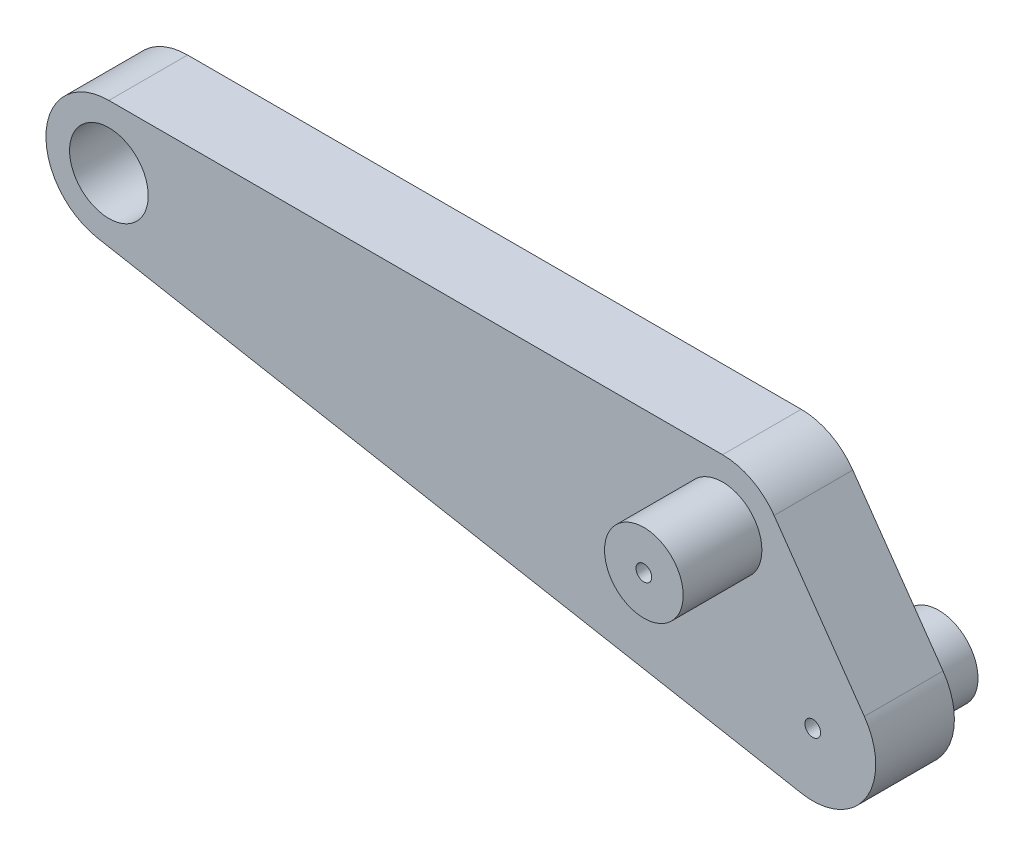
ISO-10303-21;
HEADER;
FILE_DESCRIPTION(('STEP AP214'),'2;1');
FILE_NAME('part.step','',(''),(''),'','','');
FILE_SCHEMA(('AUTOMOTIVE_DESIGN { 1 0 10303 214 1 1 1 1 }'));
ENDSEC;
DATA;
#1=APPLICATION_CONTEXT('core data for automotive mechanical design processes');
#2=APPLICATION_PROTOCOL_DEFINITION('international standard','automotive_design',2000,#1);
#3=PRODUCT_CONTEXT('',#1,'mechanical');
#4=PRODUCT('Part','Part','',(#3));
#5=PRODUCT_RELATED_PRODUCT_CATEGORY('part','',(#4));
#6=PRODUCT_DEFINITION_FORMATION('','',#4);
#7=PRODUCT_DEFINITION_CONTEXT('part definition',#1,'design');
#8=PRODUCT_DEFINITION('design','',#6,#7);
#9=PRODUCT_DEFINITION_SHAPE('','',#8);
#10=(LENGTH_UNIT() NAMED_UNIT(*) SI_UNIT(.MILLI.,.METRE.));
#11=(NAMED_UNIT(*) PLANE_ANGLE_UNIT() SI_UNIT($,.RADIAN.));
#12=(NAMED_UNIT(*) SI_UNIT($,.STERADIAN.) SOLID_ANGLE_UNIT());
#13=UNCERTAINTY_MEASURE_WITH_UNIT(LENGTH_MEASURE(1.E-05),#10,'distance_accuracy_value','');
#14=(GEOMETRIC_REPRESENTATION_CONTEXT(3) GLOBAL_UNCERTAINTY_ASSIGNED_CONTEXT((#13)) GLOBAL_UNIT_ASSIGNED_CONTEXT((#10,
#11,#12)) REPRESENTATION_CONTEXT('',''));
#15=CARTESIAN_POINT('',(0.,0.,0.));
#16=DIRECTION('',(0.,0.,1.));
#17=DIRECTION('',(1.,0.,0.));
#18=AXIS2_PLACEMENT_3D('',#15,#16,#17);
#19=CARTESIAN_POINT('',(0.,0.,5.));
#20=DIRECTION('',(0.,0.,1.));
#21=DIRECTION('',(1.,0.,0.));
#22=AXIS2_PLACEMENT_3D('',#19,#20,#21);
#23=PLANE('',#22);
#24=CARTESIAN_POINT('',(0.,0.,5.));
#25=DIRECTION('',(0.,0.,1.));
#26=DIRECTION('',(1.,0.,0.));
#27=AXIS2_PLACEMENT_3D('',#24,#25,#26);
#28=CIRCLE('',#27,2.5);
#29=CARTESIAN_POINT('',(2.5,0.,5.));
#30=VERTEX_POINT('',#29);
#31=EDGE_CURVE('E215',#30,#30,#28,.T.);
#32=ORIENTED_EDGE('',*,*,#31,.F.);
#33=EDGE_LOOP('',(#32));
#34=FACE_BOUND('',#33,.T.);
#35=CARTESIAN_POINT('',(0.,0.,5.));
#36=DIRECTION('',(0.,0.,1.));
#37=DIRECTION('',(1.,0.,0.));
#38=AXIS2_PLACEMENT_3D('',#35,#36,#37);
#39=CIRCLE('',#38,4.);
#40=CARTESIAN_POINT('',(3.27660817715596,2.2943057454042,5.));
#41=VERTEX_POINT('',#40);
#42=CARTESIAN_POINT('',(0.,4.,5.));
#43=VERTEX_POINT('',#42);
#44=EDGE_CURVE('E130',#41,#43,#39,.T.);
#45=ORIENTED_EDGE('',*,*,#44,.T.);
#46=DIRECTION('',(-1.,0.,0.));
#47=VECTOR('',#46,1.);
#48=CARTESIAN_POINT('',(-39.,3.99999999999999,5.));
#49=LINE('',#48,#47);
#50=CARTESIAN_POINT('',(-39.,3.99999999999999,5.));
#51=VERTEX_POINT('',#50);
#52=EDGE_CURVE('E88',#43,#51,#49,.T.);
#53=ORIENTED_EDGE('',*,*,#52,.T.);
#54=CARTESIAN_POINT('',(-39.,0.,5.));
#55=DIRECTION('',(0.,0.,1.));
#56=DIRECTION('',(1.,0.,0.));
#57=AXIS2_PLACEMENT_3D('',#54,#55,#56);
#58=CIRCLE('',#57,4.);
#59=CARTESIAN_POINT('',(-39.7204574488186,-3.93458270524865,5.));
#60=VERTEX_POINT('',#59);
#61=EDGE_CURVE('E101',#51,#60,#58,.T.);
#62=ORIENTED_EDGE('',*,*,#61,.T.);
#63=DIRECTION('',(0.983645676312162,-0.180114362204653,0.));
#64=VECTOR('',#63,1.);
#65=CARTESIAN_POINT('',(5.01530691469189,-12.1261031481385,5.));
#66=LINE('',#65,#64);
#67=CARTESIAN_POINT('',(5.01530691469189,-12.1261031481385,5.));
#68=VERTEX_POINT('',#67);
#69=EDGE_CURVE('E95',#60,#68,#66,.T.);
#70=ORIENTED_EDGE('',*,*,#69,.T.);
#71=CARTESIAN_POINT('',(5.7357643635105,-8.19152044288989,5.));
#72=DIRECTION('',(0.,0.,1.));
#73=DIRECTION('',(1.,0.,0.));
#74=AXIS2_PLACEMENT_3D('',#71,#72,#73);
#75=CIRCLE('',#74,4.);
#76=CARTESIAN_POINT('',(9.01237254066646,-5.89721469748569,5.));
#77=VERTEX_POINT('',#76);
#78=EDGE_CURVE('E99',#68,#77,#75,.T.);
#79=ORIENTED_EDGE('',*,*,#78,.T.);
#80=DIRECTION('',(-0.57357643635105,0.819152044288989,0.));
#81=VECTOR('',#80,1.);
#82=CARTESIAN_POINT('',(3.27660817715596,2.2943057454042,5.));
#83=LINE('',#82,#81);
#84=EDGE_CURVE('E51',#77,#41,#83,.T.);
#85=ORIENTED_EDGE('',*,*,#84,.T.);
#86=EDGE_LOOP('',(#45,#53,#62,#70,#79,#85));
#87=FACE_BOUND('',#86,.T.);
#88=CARTESIAN_POINT('',(-39.,0.,5.));
#89=DIRECTION('',(0.,0.,1.));
#90=DIRECTION('',(1.,0.,0.));
#91=AXIS2_PLACEMENT_3D('',#88,#89,#90);
#92=CIRCLE('',#91,2.5);
#93=CARTESIAN_POINT('',(-36.5,0.,5.));
#94=VERTEX_POINT('',#93);
#95=EDGE_CURVE('E123',#94,#94,#92,.T.);
#96=ORIENTED_EDGE('',*,*,#95,.F.);
#97=EDGE_LOOP('',(#96));
#98=FACE_BOUND('',#97,.T.);
#99=CARTESIAN_POINT('',(5.7357643635105,-8.19152044288989,5.));
#100=DIRECTION('',(0.,0.,1.));
#101=DIRECTION('',(1.,0.,0.));
#102=AXIS2_PLACEMENT_3D('',#99,#100,#101);
#103=CIRCLE('',#102,0.5);
#104=CARTESIAN_POINT('',(6.2357643635105,-8.19152044288989,5.));
#105=VERTEX_POINT('',#104);
#106=EDGE_CURVE('E203',#105,#105,#103,.T.);
#107=ORIENTED_EDGE('',*,*,#106,.F.);
#108=EDGE_LOOP('',(#107));
#109=FACE_BOUND('',#108,.T.);
#110=ADVANCED_FACE('F34',(#34,#87,#98,#109),#23,.T.);
#111=CARTESIAN_POINT('',(0.,0.,0.));
#112=DIRECTION('',(0.,0.,1.));
#113=DIRECTION('',(1.,0.,0.));
#114=AXIS2_PLACEMENT_3D('',#111,#112,#113);
#115=PLANE('',#114);
#116=CARTESIAN_POINT('',(0.,0.,0.));
#117=DIRECTION('',(0.,0.,1.));
#118=DIRECTION('',(1.,0.,0.));
#119=AXIS2_PLACEMENT_3D('',#116,#117,#118);
#120=CIRCLE('',#119,4.);
#121=CARTESIAN_POINT('',(3.27660817715596,2.2943057454042,0.));
#122=VERTEX_POINT('',#121);
#123=CARTESIAN_POINT('',(0.,4.,0.));
#124=VERTEX_POINT('',#123);
#125=EDGE_CURVE('E119',#122,#124,#120,.T.);
#126=ORIENTED_EDGE('',*,*,#125,.F.);
#127=DIRECTION('',(-0.57357643635105,0.819152044288989,0.));
#128=VECTOR('',#127,1.);
#129=CARTESIAN_POINT('',(3.27660817715596,2.2943057454042,0.));
#130=LINE('',#129,#128);
#131=CARTESIAN_POINT('',(9.01237254066646,-5.89721469748569,0.));
#132=VERTEX_POINT('',#131);
#133=EDGE_CURVE('E80',#132,#122,#130,.T.);
#134=ORIENTED_EDGE('',*,*,#133,.F.);
#135=CARTESIAN_POINT('',(5.7357643635105,-8.19152044288989,0.));
#136=DIRECTION('',(0.,0.,1.));
#137=DIRECTION('',(1.,0.,0.));
#138=AXIS2_PLACEMENT_3D('',#135,#136,#137);
#139=CIRCLE('',#138,4.);
#140=CARTESIAN_POINT('',(5.01530691469189,-12.1261031481385,0.));
#141=VERTEX_POINT('',#140);
#142=EDGE_CURVE('E74',#141,#132,#139,.T.);
#143=ORIENTED_EDGE('',*,*,#142,.F.);
#144=DIRECTION('',(0.983645676312162,-0.180114362204653,0.));
#145=VECTOR('',#144,1.);
#146=CARTESIAN_POINT('',(5.01530691469189,-12.1261031481385,0.));
#147=LINE('',#146,#145);
#148=CARTESIAN_POINT('',(-39.7204574488186,-3.93458270524865,0.));
#149=VERTEX_POINT('',#148);
#150=EDGE_CURVE('E109',#149,#141,#147,.T.);
#151=ORIENTED_EDGE('',*,*,#150,.F.);
#152=CARTESIAN_POINT('',(-39.,0.,0.));
#153=DIRECTION('',(0.,0.,1.));
#154=DIRECTION('',(1.,0.,0.));
#155=AXIS2_PLACEMENT_3D('',#152,#153,#154);
#156=CIRCLE('',#155,4.);
#157=CARTESIAN_POINT('',(-39.,3.99999999999999,0.));
#158=VERTEX_POINT('',#157);
#159=EDGE_CURVE('E125',#158,#149,#156,.T.);
#160=ORIENTED_EDGE('',*,*,#159,.F.);
#161=DIRECTION('',(-1.,0.,0.));
#162=VECTOR('',#161,1.);
#163=CARTESIAN_POINT('',(-39.,3.99999999999999,0.));
#164=LINE('',#163,#162);
#165=EDGE_CURVE('E122',#124,#158,#164,.T.);
#166=ORIENTED_EDGE('',*,*,#165,.F.);
#167=EDGE_LOOP('',(#126,#134,#143,#151,#160,#166));
#168=FACE_BOUND('',#167,.T.);
#169=CARTESIAN_POINT('',(-39.,0.,0.));
#170=DIRECTION('',(0.,0.,1.));
#171=DIRECTION('',(1.,0.,0.));
#172=AXIS2_PLACEMENT_3D('',#169,#170,#171);
#173=CIRCLE('',#172,2.5);
#174=CARTESIAN_POINT('',(-36.5,0.,0.));
#175=VERTEX_POINT('',#174);
#176=EDGE_CURVE('E218',#175,#175,#173,.T.);
#177=ORIENTED_EDGE('',*,*,#176,.T.);
#178=EDGE_LOOP('',(#177));
#179=FACE_BOUND('',#178,.T.);
#180=CARTESIAN_POINT('',(5.7357643635105,-8.19152044288989,0.));
#181=DIRECTION('',(0.,0.,1.));
#182=DIRECTION('',(1.,0.,0.));
#183=AXIS2_PLACEMENT_3D('',#180,#181,#182);
#184=CIRCLE('',#183,2.5);
#185=CARTESIAN_POINT('',(8.2357643635105,-8.19152044288989,0.));
#186=VERTEX_POINT('',#185);
#187=EDGE_CURVE('E212',#186,#186,#184,.T.);
#188=ORIENTED_EDGE('',*,*,#187,.T.);
#189=EDGE_LOOP('',(#188));
#190=FACE_BOUND('',#189,.T.);
#191=CARTESIAN_POINT('',(0.,0.,0.));
#192=DIRECTION('',(0.,0.,-1.));
#193=DIRECTION('',(-1.,0.,0.));
#194=AXIS2_PLACEMENT_3D('',#191,#192,#193);
#195=CIRCLE('',#194,0.5);
#196=CARTESIAN_POINT('',(-0.5,0.,0.));
#197=VERTEX_POINT('',#196);
#198=EDGE_CURVE('E195',#197,#197,#195,.T.);
#199=ORIENTED_EDGE('',*,*,#198,.F.);
#200=EDGE_LOOP('',(#199));
#201=FACE_BOUND('',#200,.T.);
#202=ADVANCED_FACE('F139',(#168,#179,#190,#201),#115,.F.);
#203=CARTESIAN_POINT('',(0.,0.,5.));
#204=DIRECTION('',(0.,0.,-1.));
#205=DIRECTION('',(-1.,0.,0.));
#206=AXIS2_PLACEMENT_3D('',#203,#204,#205);
#207=CYLINDRICAL_SURFACE('',#206,4.);
#208=ORIENTED_EDGE('',*,*,#125,.T.);
#209=DIRECTION('',(0.,0.,-1.));
#210=VECTOR('',#209,1.);
#211=CARTESIAN_POINT('',(0.,4.,5.));
#212=LINE('',#211,#210);
#213=EDGE_CURVE('E11',#43,#124,#212,.T.);
#214=ORIENTED_EDGE('',*,*,#213,.F.);
#215=ORIENTED_EDGE('',*,*,#44,.F.);
#216=DIRECTION('',(0.,0.,-1.));
#217=VECTOR('',#216,1.);
#218=CARTESIAN_POINT('',(3.27660817715596,2.2943057454042,5.));
#219=LINE('',#218,#217);
#220=EDGE_CURVE('E115',#41,#122,#219,.T.);
#221=ORIENTED_EDGE('',*,*,#220,.T.);
#222=EDGE_LOOP('',(#208,#214,#215,#221));
#223=FACE_BOUND('',#222,.T.);
#224=ADVANCED_FACE('F36',(#223),#207,.T.);
#225=CARTESIAN_POINT('',(-39.,3.99999999999999,5.));
#226=DIRECTION('',(0.,-1.,0.));
#227=DIRECTION('',(1.,0.,0.));
#228=AXIS2_PLACEMENT_3D('',#225,#226,#227);
#229=PLANE('',#228);
#230=ORIENTED_EDGE('',*,*,#165,.T.);
#231=DIRECTION('',(0.,0.,-1.));
#232=VECTOR('',#231,1.);
#233=CARTESIAN_POINT('',(-39.,3.99999999999999,5.));
#234=LINE('',#233,#232);
#235=EDGE_CURVE('E43',#51,#158,#234,.T.);
#236=ORIENTED_EDGE('',*,*,#235,.F.);
#237=ORIENTED_EDGE('',*,*,#52,.F.);
#238=ORIENTED_EDGE('',*,*,#213,.T.);
#239=EDGE_LOOP('',(#230,#236,#237,#238));
#240=FACE_BOUND('',#239,.T.);
#241=ADVANCED_FACE('F303',(#240),#229,.F.);
#242=CARTESIAN_POINT('',(-39.,0.,5.));
#243=DIRECTION('',(0.,0.,-1.));
#244=DIRECTION('',(-1.,0.,0.));
#245=AXIS2_PLACEMENT_3D('',#242,#243,#244);
#246=CYLINDRICAL_SURFACE('',#245,4.);
#247=ORIENTED_EDGE('',*,*,#159,.T.);
#248=DIRECTION('',(0.,0.,-1.));
#249=VECTOR('',#248,1.);
#250=CARTESIAN_POINT('',(-39.7204574488186,-3.93458270524865,5.));
#251=LINE('',#250,#249);
#252=EDGE_CURVE('E110',#60,#149,#251,.T.);
#253=ORIENTED_EDGE('',*,*,#252,.F.);
#254=ORIENTED_EDGE('',*,*,#61,.F.);
#255=ORIENTED_EDGE('',*,*,#235,.T.);
#256=EDGE_LOOP('',(#247,#253,#254,#255));
#257=FACE_BOUND('',#256,.T.);
#258=ADVANCED_FACE('F136',(#257),#246,.T.);
#259=CARTESIAN_POINT('',(5.01530691469189,-12.1261031481385,5.));
#260=DIRECTION('',(0.180114362204653,0.983645676312162,0.));
#261=DIRECTION('',(-0.983645676312162,0.180114362204653,0.));
#262=AXIS2_PLACEMENT_3D('',#259,#260,#261);
#263=PLANE('',#262);
#264=ORIENTED_EDGE('',*,*,#150,.T.);
#265=DIRECTION('',(0.,0.,-1.));
#266=VECTOR('',#265,1.);
#267=CARTESIAN_POINT('',(5.01530691469189,-12.1261031481385,5.));
#268=LINE('',#267,#266);
#269=EDGE_CURVE('E106',#68,#141,#268,.T.);
#270=ORIENTED_EDGE('',*,*,#269,.F.);
#271=ORIENTED_EDGE('',*,*,#69,.F.);
#272=ORIENTED_EDGE('',*,*,#252,.T.);
#273=EDGE_LOOP('',(#264,#270,#271,#272));
#274=FACE_BOUND('',#273,.T.);
#275=ADVANCED_FACE('F107',(#274),#263,.F.);
#276=CARTESIAN_POINT('',(5.7357643635105,-8.19152044288989,5.));
#277=DIRECTION('',(0.,0.,-1.));
#278=DIRECTION('',(-1.,0.,0.));
#279=AXIS2_PLACEMENT_3D('',#276,#277,#278);
#280=CYLINDRICAL_SURFACE('',#279,4.);
#281=ORIENTED_EDGE('',*,*,#142,.T.);
#282=DIRECTION('',(0.,0.,-1.));
#283=VECTOR('',#282,1.);
#284=CARTESIAN_POINT('',(9.01237254066646,-5.89721469748569,5.));
#285=LINE('',#284,#283);
#286=EDGE_CURVE('E111',#77,#132,#285,.T.);
#287=ORIENTED_EDGE('',*,*,#286,.F.);
#288=ORIENTED_EDGE('',*,*,#78,.F.);
#289=ORIENTED_EDGE('',*,*,#269,.T.);
#290=EDGE_LOOP('',(#281,#287,#288,#289));
#291=FACE_BOUND('',#290,.T.);
#292=ADVANCED_FACE('F113',(#291),#280,.T.);
#293=CARTESIAN_POINT('',(3.27660817715596,2.2943057454042,5.));
#294=DIRECTION('',(-0.819152044288989,-0.57357643635105,0.));
#295=DIRECTION('',(0.57357643635105,-0.819152044288989,0.));
#296=AXIS2_PLACEMENT_3D('',#293,#294,#295);
#297=PLANE('',#296);
#298=ORIENTED_EDGE('',*,*,#133,.T.);
#299=ORIENTED_EDGE('',*,*,#220,.F.);
#300=ORIENTED_EDGE('',*,*,#84,.F.);
#301=ORIENTED_EDGE('',*,*,#286,.T.);
#302=EDGE_LOOP('',(#298,#299,#300,#301));
#303=FACE_BOUND('',#302,.T.);
#304=ADVANCED_FACE('F144',(#303),#297,.F.);
#305=CARTESIAN_POINT('',(-39.,0.,5.));
#306=DIRECTION('',(0.,0.,-1.));
#307=DIRECTION('',(-1.,0.,0.));
#308=AXIS2_PLACEMENT_3D('',#305,#306,#307);
#309=CYLINDRICAL_SURFACE('',#308,2.5);
#310=ORIENTED_EDGE('',*,*,#95,.T.);
#311=EDGE_LOOP('',(#310));
#312=FACE_BOUND('',#311,.T.);
#313=ORIENTED_EDGE('',*,*,#176,.F.);
#314=EDGE_LOOP('',(#313));
#315=FACE_BOUND('',#314,.T.);
#316=ADVANCED_FACE('F146',(#312,#315),#309,.F.);
#317=CARTESIAN_POINT('',(5.7357643635105,-8.19152044288989,-3.));
#318=DIRECTION('',(0.,0.,1.));
#319=DIRECTION('',(1.,0.,0.));
#320=AXIS2_PLACEMENT_3D('',#317,#318,#319);
#321=CYLINDRICAL_SURFACE('',#320,2.5);
#322=CARTESIAN_POINT('',(5.7357643635105,-8.19152044288989,-3.));
#323=DIRECTION('',(0.,0.,1.));
#324=DIRECTION('',(1.,0.,0.));
#325=AXIS2_PLACEMENT_3D('',#322,#323,#324);
#326=CIRCLE('',#325,2.5);
#327=CARTESIAN_POINT('',(8.2357643635105,-8.19152044288989,-3.));
#328=VERTEX_POINT('',#327);
#329=EDGE_CURVE('E207',#328,#328,#326,.T.);
#330=ORIENTED_EDGE('',*,*,#329,.T.);
#331=EDGE_LOOP('',(#330));
#332=FACE_BOUND('',#331,.T.);
#333=ORIENTED_EDGE('',*,*,#187,.F.);
#334=EDGE_LOOP('',(#333));
#335=FACE_BOUND('',#334,.T.);
#336=ADVANCED_FACE('F152',(#332,#335),#321,.T.);
#337=CARTESIAN_POINT('',(5.7357643635105,-8.19152044288989,-3.));
#338=DIRECTION('',(0.,0.,1.));
#339=DIRECTION('',(1.,0.,0.));
#340=AXIS2_PLACEMENT_3D('',#337,#338,#339);
#341=PLANE('',#340);
#342=CARTESIAN_POINT('',(5.7357643635105,-8.19152044288989,-3.));
#343=DIRECTION('',(0.,0.,1.));
#344=DIRECTION('',(1.,0.,0.));
#345=AXIS2_PLACEMENT_3D('',#342,#343,#344);
#346=CIRCLE('',#345,0.5);
#347=CARTESIAN_POINT('',(6.2357643635105,-8.19152044288989,-3.));
#348=VERTEX_POINT('',#347);
#349=EDGE_CURVE('E204',#348,#348,#346,.T.);
#350=ORIENTED_EDGE('',*,*,#349,.T.);
#351=EDGE_LOOP('',(#350));
#352=FACE_BOUND('',#351,.T.);
#353=ORIENTED_EDGE('',*,*,#329,.F.);
#354=EDGE_LOOP('',(#353));
#355=FACE_BOUND('',#354,.T.);
#356=ADVANCED_FACE('F167',(#352,#355),#341,.F.);
#357=CARTESIAN_POINT('',(5.7357643635105,-8.19152044288989,-3.));
#358=DIRECTION('',(0.,0.,1.));
#359=DIRECTION('',(1.,0.,0.));
#360=AXIS2_PLACEMENT_3D('',#357,#358,#359);
#361=CYLINDRICAL_SURFACE('',#360,0.5);
#362=ORIENTED_EDGE('',*,*,#349,.F.);
#363=EDGE_LOOP('',(#362));
#364=FACE_BOUND('',#363,.T.);
#365=ORIENTED_EDGE('',*,*,#106,.T.);
#366=EDGE_LOOP('',(#365));
#367=FACE_BOUND('',#366,.T.);
#368=ADVANCED_FACE('F171',(#364,#367),#361,.F.);
#369=CARTESIAN_POINT('',(0.,0.,10.));
#370=DIRECTION('',(0.,0.,-1.));
#371=DIRECTION('',(-1.,0.,0.));
#372=AXIS2_PLACEMENT_3D('',#369,#370,#371);
#373=CYLINDRICAL_SURFACE('',#372,2.5);
#374=ORIENTED_EDGE('',*,*,#31,.T.);
#375=EDGE_LOOP('',(#374));
#376=FACE_BOUND('',#375,.T.);
#377=CARTESIAN_POINT('',(0.,0.,10.));
#378=DIRECTION('',(0.,0.,-1.));
#379=DIRECTION('',(-1.,0.,0.));
#380=AXIS2_PLACEMENT_3D('',#377,#378,#379);
#381=CIRCLE('',#380,2.5);
#382=CARTESIAN_POINT('',(-2.5,0.,10.));
#383=VERTEX_POINT('',#382);
#384=EDGE_CURVE('E198',#383,#383,#381,.T.);
#385=ORIENTED_EDGE('',*,*,#384,.T.);
#386=EDGE_LOOP('',(#385));
#387=FACE_BOUND('',#386,.T.);
#388=ADVANCED_FACE('F175',(#376,#387),#373,.T.);
#389=CARTESIAN_POINT('',(0.,0.,10.));
#390=DIRECTION('',(0.,0.,-1.));
#391=DIRECTION('',(-1.,0.,0.));
#392=AXIS2_PLACEMENT_3D('',#389,#390,#391);
#393=PLANE('',#392);
#394=CARTESIAN_POINT('',(0.,0.,10.));
#395=DIRECTION('',(0.,0.,-1.));
#396=DIRECTION('',(-1.,0.,0.));
#397=AXIS2_PLACEMENT_3D('',#394,#395,#396);
#398=CIRCLE('',#397,0.5);
#399=CARTESIAN_POINT('',(-0.5,0.,10.));
#400=VERTEX_POINT('',#399);
#401=EDGE_CURVE('E192',#400,#400,#398,.T.);
#402=ORIENTED_EDGE('',*,*,#401,.T.);
#403=EDGE_LOOP('',(#402));
#404=FACE_BOUND('',#403,.T.);
#405=ORIENTED_EDGE('',*,*,#384,.F.);
#406=EDGE_LOOP('',(#405));
#407=FACE_BOUND('',#406,.T.);
#408=ADVANCED_FACE('F179',(#404,#407),#393,.F.);
#409=CARTESIAN_POINT('',(0.,0.,10.));
#410=DIRECTION('',(0.,0.,-1.));
#411=DIRECTION('',(-1.,0.,0.));
#412=AXIS2_PLACEMENT_3D('',#409,#410,#411);
#413=CYLINDRICAL_SURFACE('',#412,0.5);
#414=ORIENTED_EDGE('',*,*,#401,.F.);
#415=EDGE_LOOP('',(#414));
#416=FACE_BOUND('',#415,.T.);
#417=ORIENTED_EDGE('',*,*,#198,.T.);
#418=EDGE_LOOP('',(#417));
#419=FACE_BOUND('',#418,.T.);
#420=ADVANCED_FACE('F183',(#416,#419),#413,.F.);
#421=CLOSED_SHELL('',(#110,#202,#224,#241,#258,#275,#292,#304,#316,#336,#356,#368,#388,#408,#420));
#422=MANIFOLD_SOLID_BREP('B2',#421);
#423=ADVANCED_BREP_SHAPE_REPRESENTATION('',(#18,#422),#14);
#424=SHAPE_DEFINITION_REPRESENTATION(#9,#423);
ENDSEC;
END-ISO-10303-21;
